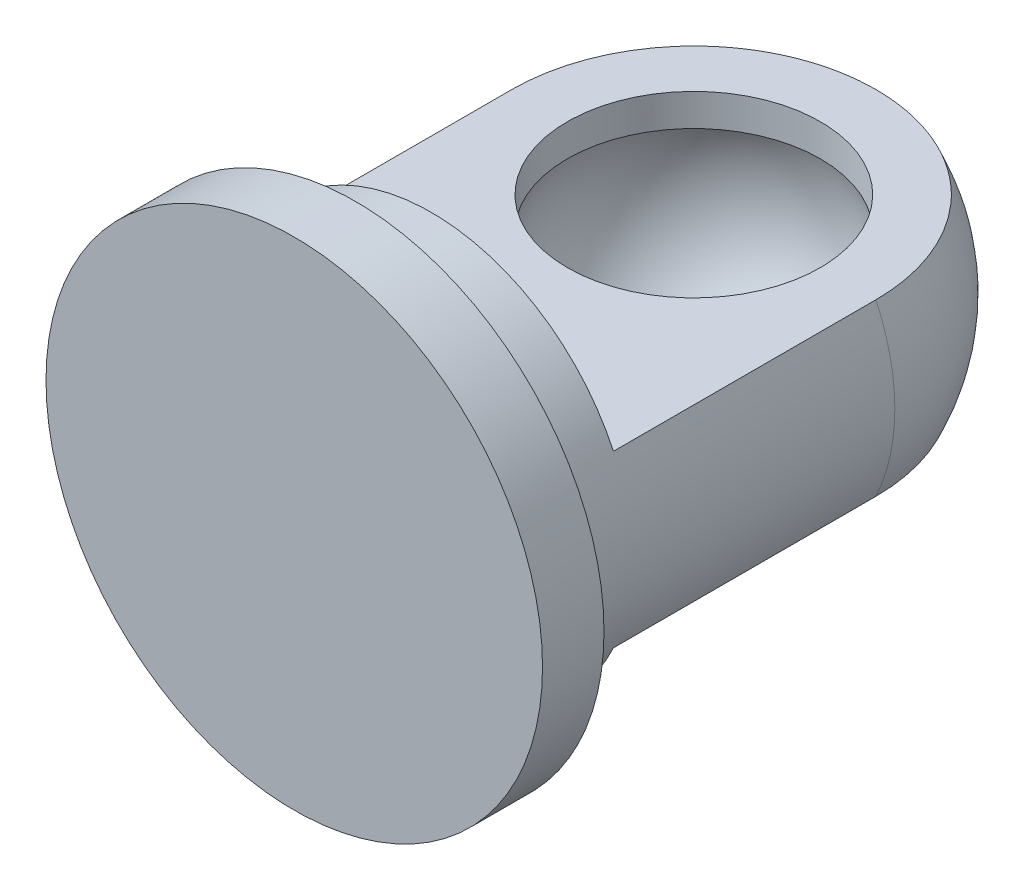
ISO-10303-21;
HEADER;
FILE_DESCRIPTION(('STEP AP214'),'2;1');
FILE_NAME('part.step','',(''),(''),'','','');
FILE_SCHEMA(('AUTOMOTIVE_DESIGN { 1 0 10303 214 1 1 1 1 }'));
ENDSEC;
DATA;
#1=APPLICATION_CONTEXT('core data for automotive mechanical design processes');
#2=APPLICATION_PROTOCOL_DEFINITION('international standard','automotive_design',2000,#1);
#3=PRODUCT_CONTEXT('',#1,'mechanical');
#4=PRODUCT('Part','Part','',(#3));
#5=PRODUCT_RELATED_PRODUCT_CATEGORY('part','',(#4));
#6=PRODUCT_DEFINITION_FORMATION('','',#4);
#7=PRODUCT_DEFINITION_CONTEXT('part definition',#1,'design');
#8=PRODUCT_DEFINITION('design','',#6,#7);
#9=PRODUCT_DEFINITION_SHAPE('','',#8);
#10=(LENGTH_UNIT() NAMED_UNIT(*) SI_UNIT(.MILLI.,.METRE.));
#11=(NAMED_UNIT(*) PLANE_ANGLE_UNIT() SI_UNIT($,.RADIAN.));
#12=(NAMED_UNIT(*) SI_UNIT($,.STERADIAN.) SOLID_ANGLE_UNIT());
#13=UNCERTAINTY_MEASURE_WITH_UNIT(LENGTH_MEASURE(1.E-05),#10,'distance_accuracy_value','');
#14=(GEOMETRIC_REPRESENTATION_CONTEXT(3) GLOBAL_UNCERTAINTY_ASSIGNED_CONTEXT((#13)) GLOBAL_UNIT_ASSIGNED_CONTEXT((#10,
#11,#12)) REPRESENTATION_CONTEXT('',''));
#15=CARTESIAN_POINT('',(0.,0.,0.));
#16=DIRECTION('',(0.,0.,1.));
#17=DIRECTION('',(1.,0.,0.));
#18=AXIS2_PLACEMENT_3D('',#15,#16,#17);
#19=CARTESIAN_POINT('',(0.,0.,-1.3));
#20=DIRECTION('',(0.,0.,1.));
#21=DIRECTION('',(1.,0.,0.));
#22=AXIS2_PLACEMENT_3D('',#19,#20,#21);
#23=CYLINDRICAL_SURFACE('',#22,4.25);
#24=CARTESIAN_POINT('',(0.,0.,-1.3));
#25=DIRECTION('',(0.,0.,1.));
#26=DIRECTION('',(1.,0.,0.));
#27=AXIS2_PLACEMENT_3D('',#24,#25,#26);
#28=CIRCLE('',#27,4.25);
#29=CARTESIAN_POINT('',(4.25,0.,-1.3));
#30=VERTEX_POINT('',#29);
#31=EDGE_CURVE('E111',#30,#30,#28,.T.);
#32=ORIENTED_EDGE('',*,*,#31,.F.);
#33=EDGE_LOOP('',(#32));
#34=FACE_BOUND('',#33,.T.);
#35=CARTESIAN_POINT('',(0.,0.,-2.9));
#36=DIRECTION('',(0.,0.,1.));
#37=DIRECTION('',(1.,0.,0.));
#38=AXIS2_PLACEMENT_3D('',#35,#36,#37);
#39=CIRCLE('',#38,4.25);
#40=CARTESIAN_POINT('',(3.85,-1.8,-2.9));
#41=VERTEX_POINT('',#40);
#42=CARTESIAN_POINT('',(-3.85,-1.8,-2.9));
#43=VERTEX_POINT('',#42);
#44=EDGE_CURVE('E12',#41,#43,#39,.F.);
#45=ORIENTED_EDGE('',*,*,#44,.F.);
#46=DIRECTION('',(0.,0.,1.));
#47=VECTOR('',#46,1.);
#48=CARTESIAN_POINT('',(3.85,-1.8,-1.3));
#49=LINE('',#48,#47);
#50=CARTESIAN_POINT('',(3.85,-1.8,-8.45));
#51=VERTEX_POINT('',#50);
#52=EDGE_CURVE('E107',#41,#51,#49,.F.);
#53=ORIENTED_EDGE('',*,*,#52,.T.);
#54=CARTESIAN_POINT('',(0.,0.,-8.45));
#55=DIRECTION('',(0.,0.,1.));
#56=DIRECTION('',(1.,0.,0.));
#57=AXIS2_PLACEMENT_3D('',#54,#55,#56);
#58=CIRCLE('',#57,4.25);
#59=CARTESIAN_POINT('',(3.85,1.8,-8.45));
#60=VERTEX_POINT('',#59);
#61=EDGE_CURVE('E96',#51,#60,#58,.T.);
#62=ORIENTED_EDGE('',*,*,#61,.T.);
#63=DIRECTION('',(0.,0.,1.));
#64=VECTOR('',#63,1.);
#65=CARTESIAN_POINT('',(3.85,1.8,-1.3));
#66=LINE('',#65,#64);
#67=CARTESIAN_POINT('',(3.85,1.8,-2.9));
#68=VERTEX_POINT('',#67);
#69=EDGE_CURVE('E63',#60,#68,#66,.T.);
#70=ORIENTED_EDGE('',*,*,#69,.T.);
#71=CARTESIAN_POINT('',(-3.85,1.8,-2.9));
#72=VERTEX_POINT('',#71);
#73=EDGE_CURVE('E44',#72,#68,#39,.F.);
#74=ORIENTED_EDGE('',*,*,#73,.F.);
#75=DIRECTION('',(0.,0.,1.));
#76=VECTOR('',#75,1.);
#77=CARTESIAN_POINT('',(-3.85,1.8,-1.3));
#78=LINE('',#77,#76);
#79=CARTESIAN_POINT('',(-3.85,1.8,-8.45));
#80=VERTEX_POINT('',#79);
#81=EDGE_CURVE('E88',#72,#80,#78,.F.);
#82=ORIENTED_EDGE('',*,*,#81,.T.);
#83=CARTESIAN_POINT('',(-3.85,-1.8,-8.45));
#84=VERTEX_POINT('',#83);
#85=EDGE_CURVE('E110',#80,#84,#58,.T.);
#86=ORIENTED_EDGE('',*,*,#85,.T.);
#87=DIRECTION('',(0.,0.,1.));
#88=VECTOR('',#87,1.);
#89=CARTESIAN_POINT('',(-3.85,-1.8,-1.3));
#90=LINE('',#89,#88);
#91=EDGE_CURVE('E55',#84,#43,#90,.T.);
#92=ORIENTED_EDGE('',*,*,#91,.T.);
#93=EDGE_LOOP('',(#45,#53,#62,#70,#74,#82,#86,#92));
#94=FACE_BOUND('',#93,.T.);
#95=ADVANCED_FACE('F40',(#34,#94),#23,.T.);
#96=CARTESIAN_POINT('',(0.,0.,-8.45));
#97=DIRECTION('',(0.,0.,1.));
#98=DIRECTION('',(1.,0.,0.));
#99=AXIS2_PLACEMENT_3D('',#96,#97,#98);
#100=SPHERICAL_SURFACE('',#99,4.25);
#101=ORIENTED_EDGE('',*,*,#61,.F.);
#102=CARTESIAN_POINT('',(0.,-1.8,-8.45));
#103=DIRECTION('',(0.,-1.,0.));
#104=DIRECTION('',(0.,0.,-1.));
#105=AXIS2_PLACEMENT_3D('',#102,#103,#104);
#106=CIRCLE('',#105,3.85);
#107=EDGE_CURVE('E104',#51,#84,#106,.F.);
#108=ORIENTED_EDGE('',*,*,#107,.T.);
#109=ORIENTED_EDGE('',*,*,#85,.F.);
#110=CARTESIAN_POINT('',(0.,1.8,-8.45));
#111=DIRECTION('',(0.,1.,0.));
#112=DIRECTION('',(0.,0.,1.));
#113=AXIS2_PLACEMENT_3D('',#110,#111,#112);
#114=CIRCLE('',#113,3.85);
#115=EDGE_CURVE('E97',#80,#60,#114,.F.);
#116=ORIENTED_EDGE('',*,*,#115,.T.);
#117=EDGE_LOOP('',(#101,#108,#109,#116));
#118=FACE_BOUND('',#117,.T.);
#119=ADVANCED_FACE('F137',(#118),#100,.T.);
#120=CARTESIAN_POINT('',(0.,0.,0.));
#121=DIRECTION('',(0.,0.,1.));
#122=DIRECTION('',(1.,0.,0.));
#123=AXIS2_PLACEMENT_3D('',#120,#121,#122);
#124=PLANE('',#123);
#125=CARTESIAN_POINT('',(0.,0.,0.));
#126=DIRECTION('',(0.,0.,1.));
#127=DIRECTION('',(1.,0.,0.));
#128=AXIS2_PLACEMENT_3D('',#125,#126,#127);
#129=CIRCLE('',#128,5.25);
#130=CARTESIAN_POINT('',(5.25,0.,0.));
#131=VERTEX_POINT('',#130);
#132=EDGE_CURVE('E86',#131,#131,#129,.T.);
#133=ORIENTED_EDGE('',*,*,#132,.T.);
#134=EDGE_LOOP('',(#133));
#135=FACE_BOUND('',#134,.T.);
#136=ADVANCED_FACE('F144',(#135),#124,.T.);
#137=CARTESIAN_POINT('',(0.,0.,-1.3));
#138=DIRECTION('',(0.,0.,1.));
#139=DIRECTION('',(1.,0.,0.));
#140=AXIS2_PLACEMENT_3D('',#137,#138,#139);
#141=CYLINDRICAL_SURFACE('',#140,5.25);
#142=CARTESIAN_POINT('',(0.,0.,-1.3));
#143=DIRECTION('',(0.,0.,1.));
#144=DIRECTION('',(1.,0.,0.));
#145=AXIS2_PLACEMENT_3D('',#142,#143,#144);
#146=CIRCLE('',#145,5.25);
#147=CARTESIAN_POINT('',(5.25,0.,-1.3));
#148=VERTEX_POINT('',#147);
#149=EDGE_CURVE('E114',#148,#148,#146,.T.);
#150=ORIENTED_EDGE('',*,*,#149,.T.);
#151=EDGE_LOOP('',(#150));
#152=FACE_BOUND('',#151,.T.);
#153=ORIENTED_EDGE('',*,*,#132,.F.);
#154=EDGE_LOOP('',(#153));
#155=FACE_BOUND('',#154,.T.);
#156=ADVANCED_FACE('F152',(#152,#155),#141,.T.);
#157=CARTESIAN_POINT('',(0.,0.,-1.3));
#158=DIRECTION('',(0.,0.,1.));
#159=DIRECTION('',(1.,0.,0.));
#160=AXIS2_PLACEMENT_3D('',#157,#158,#159);
#161=PLANE('',#160);
#162=ORIENTED_EDGE('',*,*,#149,.F.);
#163=EDGE_LOOP('',(#162));
#164=FACE_BOUND('',#163,.T.);
#165=ORIENTED_EDGE('',*,*,#31,.T.);
#166=EDGE_LOOP('',(#165));
#167=FACE_BOUND('',#166,.T.);
#168=ADVANCED_FACE('F150',(#164,#167),#161,.F.);
#169=CARTESIAN_POINT('',(-7.5,1.8,-12.9));
#170=DIRECTION('',(0.,1.,0.));
#171=DIRECTION('',(0.,0.,1.));
#172=AXIS2_PLACEMENT_3D('',#169,#170,#171);
#173=PLANE('',#172);
#174=CARTESIAN_POINT('',(0.,1.8,-8.45));
#175=DIRECTION('',(0.,1.,0.));
#176=DIRECTION('',(0.,0.,1.));
#177=AXIS2_PLACEMENT_3D('',#174,#175,#176);
#178=CIRCLE('',#177,2.675);
#179=CARTESIAN_POINT('',(0.,1.8,-5.775));
#180=VERTEX_POINT('',#179);
#181=EDGE_CURVE('E212',#180,#180,#178,.T.);
#182=ORIENTED_EDGE('',*,*,#181,.F.);
#183=EDGE_LOOP('',(#182));
#184=FACE_BOUND('',#183,.T.);
#185=DIRECTION('',(-1.,0.,0.));
#186=VECTOR('',#185,1.);
#187=CARTESIAN_POINT('',(-7.5,1.8,-2.9));
#188=LINE('',#187,#186);
#189=EDGE_CURVE('E83',#68,#72,#188,.T.);
#190=ORIENTED_EDGE('',*,*,#189,.F.);
#191=ORIENTED_EDGE('',*,*,#69,.F.);
#192=ORIENTED_EDGE('',*,*,#115,.F.);
#193=ORIENTED_EDGE('',*,*,#81,.F.);
#194=EDGE_LOOP('',(#190,#191,#192,#193));
#195=FACE_BOUND('',#194,.T.);
#196=ADVANCED_FACE('F87',(#184,#195),#173,.T.);
#197=CARTESIAN_POINT('',(0.,0.,-2.9));
#198=DIRECTION('',(0.,0.,1.));
#199=DIRECTION('',(1.,0.,0.));
#200=AXIS2_PLACEMENT_3D('',#197,#198,#199);
#201=PLANE('',#200);
#202=ORIENTED_EDGE('',*,*,#73,.T.);
#203=ORIENTED_EDGE('',*,*,#189,.T.);
#204=EDGE_LOOP('',(#202,#203));
#205=FACE_BOUND('',#204,.T.);
#206=ADVANCED_FACE('F82',(#205),#201,.F.);
#207=ORIENTED_EDGE('',*,*,#44,.T.);
#208=DIRECTION('',(1.,0.,0.));
#209=VECTOR('',#208,1.);
#210=CARTESIAN_POINT('',(-7.5,-1.8,-2.9));
#211=LINE('',#210,#209);
#212=EDGE_CURVE('E89',#43,#41,#211,.T.);
#213=ORIENTED_EDGE('',*,*,#212,.T.);
#214=EDGE_LOOP('',(#207,#213));
#215=FACE_BOUND('',#214,.T.);
#216=ADVANCED_FACE('F133',(#215),#201,.F.);
#217=CARTESIAN_POINT('',(-7.5,-1.8,-12.9));
#218=DIRECTION('',(0.,-1.,0.));
#219=DIRECTION('',(0.,0.,-1.));
#220=AXIS2_PLACEMENT_3D('',#217,#218,#219);
#221=PLANE('',#220);
#222=ORIENTED_EDGE('',*,*,#212,.F.);
#223=ORIENTED_EDGE('',*,*,#91,.F.);
#224=ORIENTED_EDGE('',*,*,#107,.F.);
#225=ORIENTED_EDGE('',*,*,#52,.F.);
#226=EDGE_LOOP('',(#222,#223,#224,#225));
#227=FACE_BOUND('',#226,.T.);
#228=CARTESIAN_POINT('',(0.,-1.8,-8.45));
#229=DIRECTION('',(0.,-1.,0.));
#230=DIRECTION('',(0.,0.,-1.));
#231=AXIS2_PLACEMENT_3D('',#228,#229,#230);
#232=CIRCLE('',#231,2.27376340018041);
#233=CARTESIAN_POINT('',(0.,-1.8,-10.7237634001804));
#234=VERTEX_POINT('',#233);
#235=EDGE_CURVE('E99',#234,#234,#232,.F.);
#236=ORIENTED_EDGE('',*,*,#235,.T.);
#237=EDGE_LOOP('',(#236));
#238=FACE_BOUND('',#237,.T.);
#239=ADVANCED_FACE('F121',(#227,#238),#221,.T.);
#240=CARTESIAN_POINT('',(0.,0.,-8.45));
#241=DIRECTION('',(0.,0.,1.));
#242=DIRECTION('',(-1.,0.,0.));
#243=AXIS2_PLACEMENT_3D('',#240,#241,#242);
#244=SPHERICAL_SURFACE('',#243,2.9);
#245=CARTESIAN_POINT('',(0.,0.,-8.45));
#246=DIRECTION('',(0.,-1.,0.));
#247=DIRECTION('',(0.,0.,-1.));
#248=AXIS2_PLACEMENT_3D('',#245,#246,#247);
#249=SPHERICAL_SURFACE('',#248,2.9);
#250=CARTESIAN_POINT('',(0.,1.11998883923011,-8.45));
#251=DIRECTION('',(0.,-1.,0.));
#252=DIRECTION('',(0.,0.,-1.));
#253=AXIS2_PLACEMENT_3D('',#250,#251,#252);
#254=CIRCLE('',#253,2.675);
#255=CARTESIAN_POINT('',(0.,1.11998883923011,-11.125));
#256=VERTEX_POINT('',#255);
#257=EDGE_CURVE('E90',#256,#256,#254,.T.);
#258=ORIENTED_EDGE('',*,*,#257,.F.);
#259=EDGE_LOOP('',(#258));
#260=FACE_BOUND('',#259,.T.);
#261=ORIENTED_EDGE('',*,*,#235,.F.);
#262=EDGE_LOOP('',(#261));
#263=FACE_BOUND('',#262,.T.);
#264=ADVANCED_FACE('F42',(#260,#263),#249,.F.);
#265=CARTESIAN_POINT('',(0.,-5.251,-8.45));
#266=DIRECTION('',(0.,1.,0.));
#267=DIRECTION('',(0.,0.,1.));
#268=AXIS2_PLACEMENT_3D('',#265,#266,#267);
#269=CYLINDRICAL_SURFACE('',#268,2.675);
#270=ORIENTED_EDGE('',*,*,#181,.T.);
#271=EDGE_LOOP('',(#270));
#272=FACE_BOUND('',#271,.T.);
#273=ORIENTED_EDGE('',*,*,#257,.T.);
#274=EDGE_LOOP('',(#273));
#275=FACE_BOUND('',#274,.T.);
#276=ADVANCED_FACE('F124',(#272,#275),#269,.F.);
#277=CLOSED_SHELL('',(#95,#119,#136,#156,#168,#196,#206,#216,#239,#264,#276));
#278=MANIFOLD_SOLID_BREP('B2',#277);
#279=ADVANCED_BREP_SHAPE_REPRESENTATION('',(#18,#278),#14);
#280=SHAPE_DEFINITION_REPRESENTATION(#9,#279);
ENDSEC;
END-ISO-10303-21;
